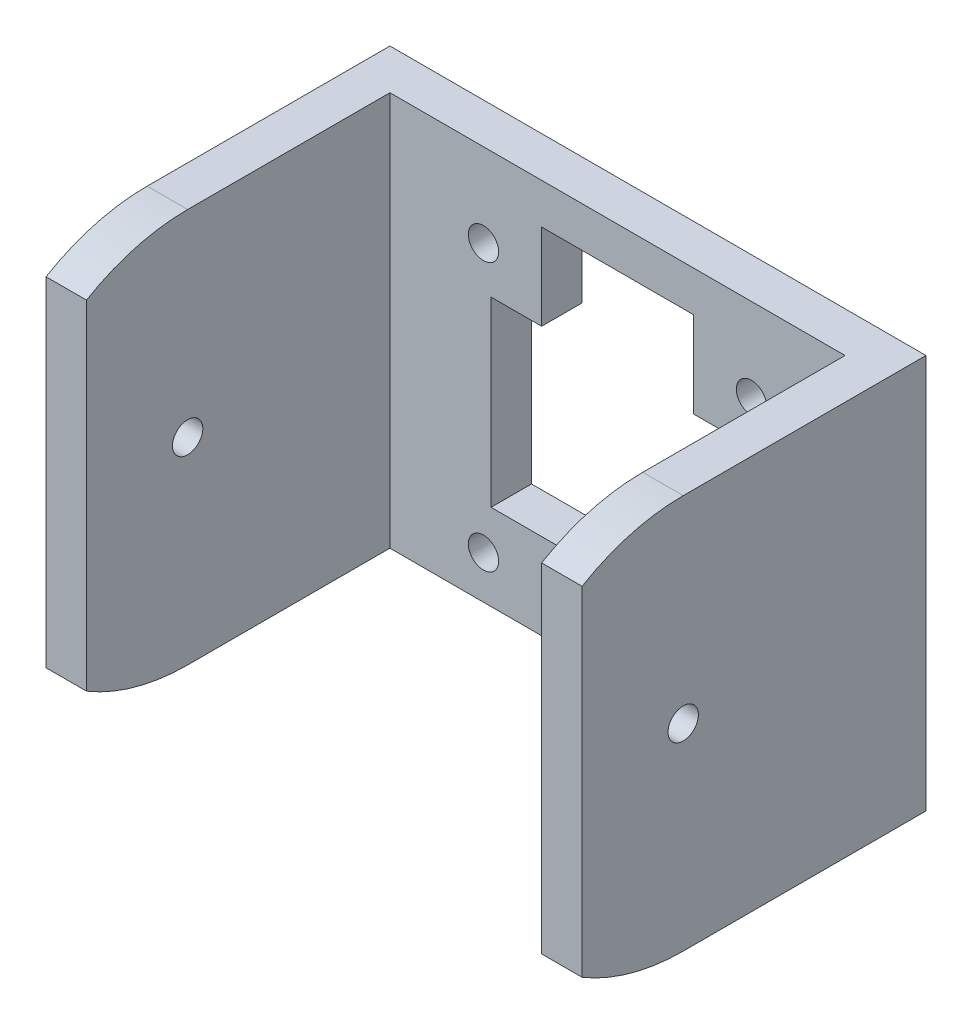
ISO-10303-21;
HEADER;
FILE_DESCRIPTION(('STEP AP214'),'2;1');
FILE_NAME('part.step','',(''),(''),'','','');
FILE_SCHEMA(('AUTOMOTIVE_DESIGN { 1 0 10303 214 1 1 1 1 }'));
ENDSEC;
DATA;
#1=APPLICATION_CONTEXT('core data for automotive mechanical design processes');
#2=APPLICATION_PROTOCOL_DEFINITION('international standard','automotive_design',2000,#1);
#3=PRODUCT_CONTEXT('',#1,'mechanical');
#4=PRODUCT('Part','Part','',(#3));
#5=PRODUCT_RELATED_PRODUCT_CATEGORY('part','',(#4));
#6=PRODUCT_DEFINITION_FORMATION('','',#4);
#7=PRODUCT_DEFINITION_CONTEXT('part definition',#1,'design');
#8=PRODUCT_DEFINITION('design','',#6,#7);
#9=PRODUCT_DEFINITION_SHAPE('','',#8);
#10=(LENGTH_UNIT() NAMED_UNIT(*) SI_UNIT(.MILLI.,.METRE.));
#11=(NAMED_UNIT(*) PLANE_ANGLE_UNIT() SI_UNIT($,.RADIAN.));
#12=(NAMED_UNIT(*) SI_UNIT($,.STERADIAN.) SOLID_ANGLE_UNIT());
#13=UNCERTAINTY_MEASURE_WITH_UNIT(LENGTH_MEASURE(1.E-05),#10,'distance_accuracy_value','');
#14=(GEOMETRIC_REPRESENTATION_CONTEXT(3) GLOBAL_UNCERTAINTY_ASSIGNED_CONTEXT((#13)) GLOBAL_UNIT_ASSIGNED_CONTEXT((#10,
#11,#12)) REPRESENTATION_CONTEXT('',''));
#15=CARTESIAN_POINT('',(0.,0.,0.));
#16=DIRECTION('',(0.,0.,1.));
#17=DIRECTION('',(1.,0.,0.));
#18=AXIS2_PLACEMENT_3D('',#15,#16,#17);
#19=CARTESIAN_POINT('',(-66.6859137443134,0.,0.));
#20=DIRECTION('',(1.,0.,0.));
#21=DIRECTION('',(0.,1.,0.));
#22=AXIS2_PLACEMENT_3D('',#19,#20,#21);
#23=PLANE('',#22);
#24=CARTESIAN_POINT('',(-66.6859137443134,28.1178512570567,24.));
#25=DIRECTION('',(1.,0.,0.));
#26=DIRECTION('',(0.,1.,0.));
#27=AXIS2_PLACEMENT_3D('',#24,#25,#26);
#28=CIRCLE('',#27,1.5);
#29=CARTESIAN_POINT('',(-66.6859137443134,29.6178512570567,24.));
#30=VERTEX_POINT('',#29);
#31=EDGE_CURVE('E455',#30,#30,#28,.F.);
#32=ORIENTED_EDGE('',*,*,#31,.T.);
#33=EDGE_LOOP('',(#32));
#34=FACE_BOUND('',#33,.T.);
#35=DIRECTION('',(0.,0.,1.));
#36=VECTOR('',#35,1.);
#37=CARTESIAN_POINT('',(-66.6859137443134,47.6178512570567,0.));
#38=LINE('',#37,#36);
#39=CARTESIAN_POINT('',(-66.6859137443134,47.6178512570567,0.));
#40=VERTEX_POINT('',#39);
#41=CARTESIAN_POINT('',(-66.6859137443134,47.6178512570567,24.));
#42=VERTEX_POINT('',#41);
#43=EDGE_CURVE('E215',#40,#42,#38,.T.);
#44=ORIENTED_EDGE('',*,*,#43,.T.);
#45=CARTESIAN_POINT('',(-66.6859137443134,28.1178512570567,24.));
#46=DIRECTION('',(1.,0.,0.));
#47=DIRECTION('',(0.,1.,0.));
#48=AXIS2_PLACEMENT_3D('',#45,#46,#47);
#49=CIRCLE('',#48,19.5);
#50=CARTESIAN_POINT('',(-66.6859137443134,44.8585202998399,34.));
#51=VERTEX_POINT('',#50);
#52=EDGE_CURVE('E180',#51,#42,#49,.F.);
#53=ORIENTED_EDGE('',*,*,#52,.F.);
#54=DIRECTION('',(0.,1.,0.));
#55=VECTOR('',#54,1.);
#56=CARTESIAN_POINT('',(-66.6859137443134,47.6178512570567,34.));
#57=LINE('',#56,#55);
#58=CARTESIAN_POINT('',(-66.6859137443134,11.3771822142735,34.));
#59=VERTEX_POINT('',#58);
#60=EDGE_CURVE('E415',#59,#51,#57,.T.);
#61=ORIENTED_EDGE('',*,*,#60,.F.);
#62=CARTESIAN_POINT('',(-66.6859137443134,28.1178512570567,24.));
#63=DIRECTION('',(1.,0.,0.));
#64=DIRECTION('',(0.,1.,0.));
#65=AXIS2_PLACEMENT_3D('',#62,#63,#64);
#66=CIRCLE('',#65,19.5);
#67=CARTESIAN_POINT('',(-66.6859137443134,8.6178512570567,24.));
#68=VERTEX_POINT('',#67);
#69=EDGE_CURVE('E468',#68,#59,#66,.F.);
#70=ORIENTED_EDGE('',*,*,#69,.F.);
#71=DIRECTION('',(0.,0.,-1.));
#72=VECTOR('',#71,1.);
#73=CARTESIAN_POINT('',(-66.6859137443134,8.61785125705671,4.));
#74=LINE('',#73,#72);
#75=CARTESIAN_POINT('',(-66.6859137443134,8.61785125705671,0.));
#76=VERTEX_POINT('',#75);
#77=EDGE_CURVE('E210',#68,#76,#74,.T.);
#78=ORIENTED_EDGE('',*,*,#77,.T.);
#79=DIRECTION('',(0.,1.,0.));
#80=VECTOR('',#79,1.);
#81=CARTESIAN_POINT('',(-66.6859137443134,8.61785125705671,0.));
#82=LINE('',#81,#80);
#83=EDGE_CURVE('E212',#76,#40,#82,.T.);
#84=ORIENTED_EDGE('',*,*,#83,.T.);
#85=EDGE_LOOP('',(#44,#53,#61,#70,#78,#84));
#86=FACE_BOUND('',#85,.T.);
#87=ADVANCED_FACE('F37',(#34,#86),#23,.T.);
#88=CARTESIAN_POINT('',(-119.685913744313,0.,0.));
#89=DIRECTION('',(-1.,0.,0.));
#90=DIRECTION('',(0.,0.,1.));
#91=AXIS2_PLACEMENT_3D('',#88,#89,#90);
#92=PLANE('',#91);
#93=CARTESIAN_POINT('',(-119.685913744313,28.1178512570567,24.));
#94=DIRECTION('',(-1.,0.,0.));
#95=DIRECTION('',(0.,0.,1.));
#96=AXIS2_PLACEMENT_3D('',#93,#94,#95);
#97=CIRCLE('',#96,1.5);
#98=CARTESIAN_POINT('',(-119.685913744313,28.1178512570567,25.5));
#99=VERTEX_POINT('',#98);
#100=EDGE_CURVE('E457',#99,#99,#97,.T.);
#101=ORIENTED_EDGE('',*,*,#100,.F.);
#102=EDGE_LOOP('',(#101));
#103=FACE_BOUND('',#102,.T.);
#104=DIRECTION('',(0.,-1.,0.));
#105=VECTOR('',#104,1.);
#106=CARTESIAN_POINT('',(-119.685913744313,47.6178512570567,34.));
#107=LINE('',#106,#105);
#108=CARTESIAN_POINT('',(-119.685913744313,44.8585202998399,34.));
#109=VERTEX_POINT('',#108);
#110=CARTESIAN_POINT('',(-119.685913744313,11.3771822142735,34.));
#111=VERTEX_POINT('',#110);
#112=EDGE_CURVE('E190',#109,#111,#107,.T.);
#113=ORIENTED_EDGE('',*,*,#112,.F.);
#114=CARTESIAN_POINT('',(-119.685913744313,28.1178512570567,24.));
#115=DIRECTION('',(-1.,0.,0.));
#116=DIRECTION('',(0.,0.,1.));
#117=AXIS2_PLACEMENT_3D('',#114,#115,#116);
#118=CIRCLE('',#117,19.5);
#119=CARTESIAN_POINT('',(-119.685913744313,47.6178512570567,24.));
#120=VERTEX_POINT('',#119);
#121=EDGE_CURVE('E61',#109,#120,#118,.T.);
#122=ORIENTED_EDGE('',*,*,#121,.T.);
#123=DIRECTION('',(0.,0.,-1.));
#124=VECTOR('',#123,1.);
#125=CARTESIAN_POINT('',(-119.685913744313,47.6178512570567,4.));
#126=LINE('',#125,#124);
#127=CARTESIAN_POINT('',(-119.685913744313,47.6178512570567,0.));
#128=VERTEX_POINT('',#127);
#129=EDGE_CURVE('E186',#120,#128,#126,.T.);
#130=ORIENTED_EDGE('',*,*,#129,.T.);
#131=DIRECTION('',(0.,-1.,0.));
#132=VECTOR('',#131,1.);
#133=CARTESIAN_POINT('',(-119.685913744313,47.6178512570567,0.));
#134=LINE('',#133,#132);
#135=CARTESIAN_POINT('',(-119.685913744313,8.6178512570567,0.));
#136=VERTEX_POINT('',#135);
#137=EDGE_CURVE('E199',#128,#136,#134,.T.);
#138=ORIENTED_EDGE('',*,*,#137,.T.);
#139=DIRECTION('',(0.,0.,1.));
#140=VECTOR('',#139,1.);
#141=CARTESIAN_POINT('',(-119.685913744313,8.6178512570567,0.));
#142=LINE('',#141,#140);
#143=CARTESIAN_POINT('',(-119.685913744313,8.6178512570567,24.));
#144=VERTEX_POINT('',#143);
#145=EDGE_CURVE('E202',#136,#144,#142,.T.);
#146=ORIENTED_EDGE('',*,*,#145,.T.);
#147=CARTESIAN_POINT('',(-119.685913744313,28.1178512570567,24.));
#148=DIRECTION('',(-1.,0.,0.));
#149=DIRECTION('',(0.,0.,1.));
#150=AXIS2_PLACEMENT_3D('',#147,#148,#149);
#151=CIRCLE('',#150,19.5);
#152=EDGE_CURVE('E464',#144,#111,#151,.T.);
#153=ORIENTED_EDGE('',*,*,#152,.T.);
#154=EDGE_LOOP('',(#113,#122,#130,#138,#146,#153));
#155=FACE_BOUND('',#154,.T.);
#156=ADVANCED_FACE('F184',(#103,#155),#92,.T.);
#157=CARTESIAN_POINT('',(-115.685913744313,47.6178512570567,34.));
#158=DIRECTION('',(-1.,0.,0.));
#159=DIRECTION('',(0.,0.,1.));
#160=AXIS2_PLACEMENT_3D('',#157,#158,#159);
#161=PLANE('',#160);
#162=CARTESIAN_POINT('',(-115.685913744313,28.1178512570567,24.));
#163=DIRECTION('',(-1.,0.,0.));
#164=DIRECTION('',(0.,0.,1.));
#165=AXIS2_PLACEMENT_3D('',#162,#163,#164);
#166=CIRCLE('',#165,1.5);
#167=CARTESIAN_POINT('',(-115.685913744313,28.1178512570567,25.5));
#168=VERTEX_POINT('',#167);
#169=EDGE_CURVE('E450',#168,#168,#166,.T.);
#170=ORIENTED_EDGE('',*,*,#169,.T.);
#171=EDGE_LOOP('',(#170));
#172=FACE_BOUND('',#171,.T.);
#173=CARTESIAN_POINT('',(-115.685913744313,28.1178512570567,24.));
#174=DIRECTION('',(-1.,0.,0.));
#175=DIRECTION('',(0.,0.,1.));
#176=AXIS2_PLACEMENT_3D('',#173,#174,#175);
#177=CIRCLE('',#176,19.5);
#178=CARTESIAN_POINT('',(-115.685913744313,44.8585202998399,34.));
#179=VERTEX_POINT('',#178);
#180=CARTESIAN_POINT('',(-115.685913744313,47.6178512570567,24.));
#181=VERTEX_POINT('',#180);
#182=EDGE_CURVE('E175',#179,#181,#177,.T.);
#183=ORIENTED_EDGE('',*,*,#182,.F.);
#184=DIRECTION('',(0.,1.,0.));
#185=VECTOR('',#184,1.);
#186=CARTESIAN_POINT('',(-115.685913744313,47.6178512570567,34.));
#187=LINE('',#186,#185);
#188=CARTESIAN_POINT('',(-115.685913744313,11.3771822142735,34.));
#189=VERTEX_POINT('',#188);
#190=EDGE_CURVE('E429',#189,#179,#187,.T.);
#191=ORIENTED_EDGE('',*,*,#190,.F.);
#192=CARTESIAN_POINT('',(-115.685913744313,28.1178512570567,24.));
#193=DIRECTION('',(-1.,0.,0.));
#194=DIRECTION('',(0.,0.,1.));
#195=AXIS2_PLACEMENT_3D('',#192,#193,#194);
#196=CIRCLE('',#195,19.5);
#197=CARTESIAN_POINT('',(-115.685913744313,8.6178512570567,24.));
#198=VERTEX_POINT('',#197);
#199=EDGE_CURVE('E53',#198,#189,#196,.T.);
#200=ORIENTED_EDGE('',*,*,#199,.F.);
#201=DIRECTION('',(0.,0.,-1.));
#202=VECTOR('',#201,1.);
#203=CARTESIAN_POINT('',(-115.685913744313,8.6178512570567,34.));
#204=LINE('',#203,#202);
#205=CARTESIAN_POINT('',(-115.685913744313,8.6178512570567,4.));
#206=VERTEX_POINT('',#205);
#207=EDGE_CURVE('E200',#198,#206,#204,.T.);
#208=ORIENTED_EDGE('',*,*,#207,.T.);
#209=DIRECTION('',(0.,1.,0.));
#210=VECTOR('',#209,1.);
#211=CARTESIAN_POINT('',(-115.685913744313,47.6178512570567,4.));
#212=LINE('',#211,#210);
#213=CARTESIAN_POINT('',(-115.685913744313,47.6178512570567,4.));
#214=VERTEX_POINT('',#213);
#215=EDGE_CURVE('E423',#206,#214,#212,.T.);
#216=ORIENTED_EDGE('',*,*,#215,.T.);
#217=DIRECTION('',(0.,0.,-1.));
#218=VECTOR('',#217,1.);
#219=CARTESIAN_POINT('',(-115.685913744313,47.6178512570567,34.));
#220=LINE('',#219,#218);
#221=EDGE_CURVE('E204',#181,#214,#220,.T.);
#222=ORIENTED_EDGE('',*,*,#221,.F.);
#223=EDGE_LOOP('',(#183,#191,#200,#208,#216,#222));
#224=FACE_BOUND('',#223,.T.);
#225=ADVANCED_FACE('F363',(#172,#224),#161,.F.);
#226=CARTESIAN_POINT('',(0.,0.,34.));
#227=DIRECTION('',(0.,0.,1.));
#228=DIRECTION('',(1.,0.,0.));
#229=AXIS2_PLACEMENT_3D('',#226,#227,#228);
#230=PLANE('',#229);
#231=ORIENTED_EDGE('',*,*,#190,.T.);
#232=DIRECTION('',(-1.,0.,0.));
#233=VECTOR('',#232,1.);
#234=CARTESIAN_POINT('',(-56.3122014227067,44.8585202998399,34.));
#235=LINE('',#234,#233);
#236=EDGE_CURVE('E416',#179,#109,#235,.T.);
#237=ORIENTED_EDGE('',*,*,#236,.T.);
#238=ORIENTED_EDGE('',*,*,#112,.T.);
#239=DIRECTION('',(-1.,0.,0.));
#240=VECTOR('',#239,1.);
#241=CARTESIAN_POINT('',(-56.3122014227067,11.3771822142735,34.));
#242=LINE('',#241,#240);
#243=EDGE_CURVE('E467',#189,#111,#242,.T.);
#244=ORIENTED_EDGE('',*,*,#243,.F.);
#245=EDGE_LOOP('',(#231,#237,#238,#244));
#246=FACE_BOUND('',#245,.T.);
#247=ADVANCED_FACE('F371',(#246),#230,.T.);
#248=CARTESIAN_POINT('',(-70.6859137443134,47.6178512570567,34.));
#249=DIRECTION('',(1.,0.,0.));
#250=DIRECTION('',(0.,0.,-1.));
#251=AXIS2_PLACEMENT_3D('',#248,#249,#250);
#252=PLANE('',#251);
#253=CARTESIAN_POINT('',(-70.6859137443134,28.1178512570567,24.));
#254=DIRECTION('',(1.,0.,0.));
#255=DIRECTION('',(0.,0.,-1.));
#256=AXIS2_PLACEMENT_3D('',#253,#254,#255);
#257=CIRCLE('',#256,1.5);
#258=CARTESIAN_POINT('',(-70.6859137443134,28.1178512570567,22.5));
#259=VERTEX_POINT('',#258);
#260=EDGE_CURVE('E41',#259,#259,#257,.T.);
#261=ORIENTED_EDGE('',*,*,#260,.T.);
#262=EDGE_LOOP('',(#261));
#263=FACE_BOUND('',#262,.T.);
#264=CARTESIAN_POINT('',(-70.6859137443134,28.1178512570567,24.));
#265=DIRECTION('',(1.,0.,0.));
#266=DIRECTION('',(0.,0.,-1.));
#267=AXIS2_PLACEMENT_3D('',#264,#265,#266);
#268=CIRCLE('',#267,19.5);
#269=CARTESIAN_POINT('',(-70.6859137443134,47.6178512570567,24.));
#270=VERTEX_POINT('',#269);
#271=CARTESIAN_POINT('',(-70.6859137443134,44.8585202998399,34.));
#272=VERTEX_POINT('',#271);
#273=EDGE_CURVE('E403',#270,#272,#268,.T.);
#274=ORIENTED_EDGE('',*,*,#273,.F.);
#275=DIRECTION('',(0.,0.,-1.));
#276=VECTOR('',#275,1.);
#277=CARTESIAN_POINT('',(-70.6859137443134,47.6178512570567,34.));
#278=LINE('',#277,#276);
#279=CARTESIAN_POINT('',(-70.6859137443134,47.6178512570567,4.));
#280=VERTEX_POINT('',#279);
#281=EDGE_CURVE('E448',#270,#280,#278,.T.);
#282=ORIENTED_EDGE('',*,*,#281,.T.);
#283=DIRECTION('',(0.,-1.,0.));
#284=VECTOR('',#283,1.);
#285=CARTESIAN_POINT('',(-70.6859137443134,47.6178512570567,4.));
#286=LINE('',#285,#284);
#287=CARTESIAN_POINT('',(-70.6859137443134,8.61785125705671,4.));
#288=VERTEX_POINT('',#287);
#289=EDGE_CURVE('E420',#280,#288,#286,.T.);
#290=ORIENTED_EDGE('',*,*,#289,.T.);
#291=DIRECTION('',(0.,0.,-1.));
#292=VECTOR('',#291,1.);
#293=CARTESIAN_POINT('',(-70.6859137443134,8.61785125705671,34.));
#294=LINE('',#293,#292);
#295=CARTESIAN_POINT('',(-70.6859137443134,8.6178512570567,24.));
#296=VERTEX_POINT('',#295);
#297=EDGE_CURVE('E425',#296,#288,#294,.T.);
#298=ORIENTED_EDGE('',*,*,#297,.F.);
#299=CARTESIAN_POINT('',(-70.6859137443134,28.1178512570567,24.));
#300=DIRECTION('',(1.,0.,0.));
#301=DIRECTION('',(0.,0.,-1.));
#302=AXIS2_PLACEMENT_3D('',#299,#300,#301);
#303=CIRCLE('',#302,19.5);
#304=CARTESIAN_POINT('',(-70.6859137443134,11.3771822142735,34.));
#305=VERTEX_POINT('',#304);
#306=EDGE_CURVE('E191',#305,#296,#303,.T.);
#307=ORIENTED_EDGE('',*,*,#306,.F.);
#308=DIRECTION('',(0.,-1.,0.));
#309=VECTOR('',#308,1.);
#310=CARTESIAN_POINT('',(-70.6859137443134,47.6178512570567,34.));
#311=LINE('',#310,#309);
#312=EDGE_CURVE('E413',#272,#305,#311,.T.);
#313=ORIENTED_EDGE('',*,*,#312,.F.);
#314=EDGE_LOOP('',(#274,#282,#290,#298,#307,#313));
#315=FACE_BOUND('',#314,.T.);
#316=ADVANCED_FACE('F375',(#263,#315),#252,.F.);
#317=CARTESIAN_POINT('',(0.,0.,34.));
#318=DIRECTION('',(0.,0.,1.));
#319=DIRECTION('',(1.,0.,0.));
#320=AXIS2_PLACEMENT_3D('',#317,#318,#319);
#321=PLANE('',#320);
#322=ORIENTED_EDGE('',*,*,#60,.T.);
#323=EDGE_CURVE('E192',#51,#272,#235,.T.);
#324=ORIENTED_EDGE('',*,*,#323,.T.);
#325=ORIENTED_EDGE('',*,*,#312,.T.);
#326=EDGE_CURVE('E465',#59,#305,#242,.T.);
#327=ORIENTED_EDGE('',*,*,#326,.F.);
#328=EDGE_LOOP('',(#322,#324,#325,#327));
#329=FACE_BOUND('',#328,.T.);
#330=ADVANCED_FACE('F377',(#329),#321,.T.);
#331=CARTESIAN_POINT('',(0.,0.,4.));
#332=DIRECTION('',(0.,0.,1.));
#333=DIRECTION('',(1.,0.,0.));
#334=AXIS2_PLACEMENT_3D('',#331,#332,#333);
#335=PLANE('',#334);
#336=DIRECTION('',(0.,-1.,0.));
#337=VECTOR('',#336,1.);
#338=CARTESIAN_POINT('',(-100.685913744313,43.6178512570567,4.));
#339=LINE('',#338,#337);
#340=CARTESIAN_POINT('',(-100.685913744313,43.6178512570567,4.));
#341=VERTEX_POINT('',#340);
#342=CARTESIAN_POINT('',(-100.685913744313,35.1178512570567,4.));
#343=VERTEX_POINT('',#342);
#344=EDGE_CURVE('E224',#341,#343,#339,.T.);
#345=ORIENTED_EDGE('',*,*,#344,.F.);
#346=DIRECTION('',(1.,0.,0.));
#347=VECTOR('',#346,1.);
#348=CARTESIAN_POINT('',(-110.685913744313,43.6178512570567,4.));
#349=LINE('',#348,#347);
#350=CARTESIAN_POINT('',(-85.6859137443134,43.6178512570567,4.));
#351=VERTEX_POINT('',#350);
#352=EDGE_CURVE('E218',#341,#351,#349,.T.);
#353=ORIENTED_EDGE('',*,*,#352,.T.);
#354=DIRECTION('',(0.,1.,0.));
#355=VECTOR('',#354,1.);
#356=CARTESIAN_POINT('',(-85.6859137443134,43.6178512570567,4.));
#357=LINE('',#356,#355);
#358=CARTESIAN_POINT('',(-85.6859137443134,35.1178512570567,4.));
#359=VERTEX_POINT('',#358);
#360=EDGE_CURVE('E237',#359,#351,#357,.T.);
#361=ORIENTED_EDGE('',*,*,#360,.F.);
#362=DIRECTION('',(-1.,0.,0.));
#363=VECTOR('',#362,1.);
#364=CARTESIAN_POINT('',(-105.685913744313,35.1178512570567,4.));
#365=LINE('',#364,#363);
#366=CARTESIAN_POINT('',(-80.6859137443134,35.1178512570567,4.));
#367=VERTEX_POINT('',#366);
#368=EDGE_CURVE('E248',#367,#359,#365,.T.);
#369=ORIENTED_EDGE('',*,*,#368,.F.);
#370=DIRECTION('',(0.,1.,0.));
#371=VECTOR('',#370,1.);
#372=CARTESIAN_POINT('',(-80.6859137443134,17.1178512570567,4.));
#373=LINE('',#372,#371);
#374=CARTESIAN_POINT('',(-80.6859137443134,17.1178512570567,4.));
#375=VERTEX_POINT('',#374);
#376=EDGE_CURVE('E244',#375,#367,#373,.T.);
#377=ORIENTED_EDGE('',*,*,#376,.F.);
#378=DIRECTION('',(1.,0.,0.));
#379=VECTOR('',#378,1.);
#380=CARTESIAN_POINT('',(-105.685913744313,17.1178512570567,4.));
#381=LINE('',#380,#379);
#382=CARTESIAN_POINT('',(-105.685913744313,17.1178512570567,4.));
#383=VERTEX_POINT('',#382);
#384=EDGE_CURVE('E254',#383,#375,#381,.T.);
#385=ORIENTED_EDGE('',*,*,#384,.F.);
#386=DIRECTION('',(0.,-1.,0.));
#387=VECTOR('',#386,1.);
#388=CARTESIAN_POINT('',(-105.685913744313,17.1178512570567,4.));
#389=LINE('',#388,#387);
#390=CARTESIAN_POINT('',(-105.685913744313,35.1178512570567,4.));
#391=VERTEX_POINT('',#390);
#392=EDGE_CURVE('E251',#391,#383,#389,.T.);
#393=ORIENTED_EDGE('',*,*,#392,.F.);
#394=EDGE_CURVE('E246',#343,#391,#365,.T.);
#395=ORIENTED_EDGE('',*,*,#394,.F.);
#396=EDGE_LOOP('',(#345,#353,#361,#369,#377,#385,#393,#395));
#397=FACE_BOUND('',#396,.T.);
#398=CARTESIAN_POINT('',(-79.9359137443134,39.3678512570567,4.));
#399=DIRECTION('',(0.,0.,1.));
#400=DIRECTION('',(1.,0.,0.));
#401=AXIS2_PLACEMENT_3D('',#398,#399,#400);
#402=CIRCLE('',#401,1.50000000000001);
#403=CARTESIAN_POINT('',(-78.4359137443133,39.3678512570567,4.));
#404=VERTEX_POINT('',#403);
#405=EDGE_CURVE('E285',#404,#404,#402,.T.);
#406=ORIENTED_EDGE('',*,*,#405,.F.);
#407=EDGE_LOOP('',(#406));
#408=FACE_BOUND('',#407,.T.);
#409=CARTESIAN_POINT('',(-106.435913744313,39.3678512570567,4.));
#410=DIRECTION('',(0.,0.,1.));
#411=DIRECTION('',(1.,0.,0.));
#412=AXIS2_PLACEMENT_3D('',#409,#410,#411);
#413=CIRCLE('',#412,1.5);
#414=CARTESIAN_POINT('',(-104.935913744313,39.3678512570567,4.));
#415=VERTEX_POINT('',#414);
#416=EDGE_CURVE('E297',#415,#415,#413,.T.);
#417=ORIENTED_EDGE('',*,*,#416,.F.);
#418=EDGE_LOOP('',(#417));
#419=FACE_BOUND('',#418,.T.);
#420=CARTESIAN_POINT('',(-79.9359137443134,12.8678512570567,4.));
#421=DIRECTION('',(0.,0.,1.));
#422=DIRECTION('',(-1.,0.,0.));
#423=AXIS2_PLACEMENT_3D('',#420,#421,#422);
#424=CIRCLE('',#423,1.50000000000001);
#425=CARTESIAN_POINT('',(-81.4359137443134,12.8678512570567,4.));
#426=VERTEX_POINT('',#425);
#427=EDGE_CURVE('E291',#426,#426,#424,.T.);
#428=ORIENTED_EDGE('',*,*,#427,.F.);
#429=EDGE_LOOP('',(#428));
#430=FACE_BOUND('',#429,.T.);
#431=CARTESIAN_POINT('',(-106.435913744313,12.8678512570567,4.));
#432=DIRECTION('',(0.,0.,1.));
#433=DIRECTION('',(-1.,0.,0.));
#434=AXIS2_PLACEMENT_3D('',#431,#432,#433);
#435=CIRCLE('',#434,1.5);
#436=CARTESIAN_POINT('',(-107.935913744313,12.8678512570567,4.));
#437=VERTEX_POINT('',#436);
#438=EDGE_CURVE('E279',#437,#437,#435,.T.);
#439=ORIENTED_EDGE('',*,*,#438,.F.);
#440=EDGE_LOOP('',(#439));
#441=FACE_BOUND('',#440,.T.);
#442=DIRECTION('',(1.,0.,0.));
#443=VECTOR('',#442,1.);
#444=CARTESIAN_POINT('',(-110.685913744313,8.6178512570567,4.));
#445=LINE('',#444,#443);
#446=EDGE_CURVE('E303',#206,#288,#445,.T.);
#447=ORIENTED_EDGE('',*,*,#446,.T.);
#448=ORIENTED_EDGE('',*,*,#289,.F.);
#449=DIRECTION('',(1.,0.,0.));
#450=VECTOR('',#449,1.);
#451=CARTESIAN_POINT('',(-110.685913744313,47.6178512570567,4.));
#452=LINE('',#451,#450);
#453=EDGE_CURVE('E219',#214,#280,#452,.T.);
#454=ORIENTED_EDGE('',*,*,#453,.F.);
#455=ORIENTED_EDGE('',*,*,#215,.F.);
#456=EDGE_LOOP('',(#447,#448,#454,#455));
#457=FACE_BOUND('',#456,.T.);
#458=ADVANCED_FACE('F317',(#397,#408,#419,#430,#441,#457),#335,.T.);
#459=CARTESIAN_POINT('',(-105.685913744313,35.1178512570567,4.));
#460=DIRECTION('',(0.,-1.,0.));
#461=DIRECTION('',(0.,0.,-1.));
#462=AXIS2_PLACEMENT_3D('',#459,#460,#461);
#463=PLANE('',#462);
#464=DIRECTION('',(0.,0.,-1.));
#465=VECTOR('',#464,1.);
#466=CARTESIAN_POINT('',(-100.685913744313,35.1178512570567,4.));
#467=LINE('',#466,#465);
#468=CARTESIAN_POINT('',(-100.685913744313,35.1178512570567,0.));
#469=VERTEX_POINT('',#468);
#470=EDGE_CURVE('E11',#343,#469,#467,.T.);
#471=ORIENTED_EDGE('',*,*,#470,.F.);
#472=ORIENTED_EDGE('',*,*,#394,.T.);
#473=DIRECTION('',(0.,0.,-1.));
#474=VECTOR('',#473,1.);
#475=CARTESIAN_POINT('',(-105.685913744313,35.1178512570567,4.));
#476=LINE('',#475,#474);
#477=CARTESIAN_POINT('',(-105.685913744313,35.1178512570567,0.));
#478=VERTEX_POINT('',#477);
#479=EDGE_CURVE('E272',#391,#478,#476,.T.);
#480=ORIENTED_EDGE('',*,*,#479,.T.);
#481=DIRECTION('',(-1.,0.,0.));
#482=VECTOR('',#481,1.);
#483=CARTESIAN_POINT('',(-105.685913744313,35.1178512570567,0.));
#484=LINE('',#483,#482);
#485=EDGE_CURVE('E259',#469,#478,#484,.T.);
#486=ORIENTED_EDGE('',*,*,#485,.F.);
#487=EDGE_LOOP('',(#471,#472,#480,#486));
#488=FACE_BOUND('',#487,.T.);
#489=ADVANCED_FACE('F340',(#488),#463,.T.);
#490=CARTESIAN_POINT('',(0.,0.,0.));
#491=DIRECTION('',(0.,0.,1.));
#492=DIRECTION('',(1.,0.,0.));
#493=AXIS2_PLACEMENT_3D('',#490,#491,#492);
#494=PLANE('',#493);
#495=DIRECTION('',(1.,0.,0.));
#496=VECTOR('',#495,1.);
#497=CARTESIAN_POINT('',(-110.685913744313,8.6178512570567,0.));
#498=LINE('',#497,#496);
#499=EDGE_CURVE('E300',#136,#76,#498,.T.);
#500=ORIENTED_EDGE('',*,*,#499,.F.);
#501=ORIENTED_EDGE('',*,*,#137,.F.);
#502=DIRECTION('',(-1.,0.,0.));
#503=VECTOR('',#502,1.);
#504=CARTESIAN_POINT('',(-110.685913744313,47.6178512570567,0.));
#505=LINE('',#504,#503);
#506=EDGE_CURVE('E197',#40,#128,#505,.T.);
#507=ORIENTED_EDGE('',*,*,#506,.F.);
#508=ORIENTED_EDGE('',*,*,#83,.F.);
#509=EDGE_LOOP('',(#500,#501,#507,#508));
#510=FACE_BOUND('',#509,.T.);
#511=CARTESIAN_POINT('',(-106.435913744313,12.8678512570567,0.));
#512=DIRECTION('',(0.,0.,1.));
#513=DIRECTION('',(-1.,0.,0.));
#514=AXIS2_PLACEMENT_3D('',#511,#512,#513);
#515=CIRCLE('',#514,1.5);
#516=CARTESIAN_POINT('',(-107.935913744313,12.8678512570567,0.));
#517=VERTEX_POINT('',#516);
#518=EDGE_CURVE('E278',#517,#517,#515,.T.);
#519=ORIENTED_EDGE('',*,*,#518,.T.);
#520=EDGE_LOOP('',(#519));
#521=FACE_BOUND('',#520,.T.);
#522=CARTESIAN_POINT('',(-79.9359137443134,39.3678512570567,0.));
#523=DIRECTION('',(0.,0.,1.));
#524=DIRECTION('',(1.,0.,0.));
#525=AXIS2_PLACEMENT_3D('',#522,#523,#524);
#526=CIRCLE('',#525,1.50000000000001);
#527=CARTESIAN_POINT('',(-78.4359137443133,39.3678512570567,0.));
#528=VERTEX_POINT('',#527);
#529=EDGE_CURVE('E282',#528,#528,#526,.T.);
#530=ORIENTED_EDGE('',*,*,#529,.T.);
#531=EDGE_LOOP('',(#530));
#532=FACE_BOUND('',#531,.T.);
#533=CARTESIAN_POINT('',(-79.9359137443134,12.8678512570567,0.));
#534=DIRECTION('',(0.,0.,1.));
#535=DIRECTION('',(-1.,0.,0.));
#536=AXIS2_PLACEMENT_3D('',#533,#534,#535);
#537=CIRCLE('',#536,1.50000000000001);
#538=CARTESIAN_POINT('',(-81.4359137443134,12.8678512570567,0.));
#539=VERTEX_POINT('',#538);
#540=EDGE_CURVE('E288',#539,#539,#537,.T.);
#541=ORIENTED_EDGE('',*,*,#540,.T.);
#542=EDGE_LOOP('',(#541));
#543=FACE_BOUND('',#542,.T.);
#544=CARTESIAN_POINT('',(-106.435913744313,39.3678512570567,0.));
#545=DIRECTION('',(0.,0.,1.));
#546=DIRECTION('',(1.,0.,0.));
#547=AXIS2_PLACEMENT_3D('',#544,#545,#546);
#548=CIRCLE('',#547,1.5);
#549=CARTESIAN_POINT('',(-104.935913744313,39.3678512570567,0.));
#550=VERTEX_POINT('',#549);
#551=EDGE_CURVE('E294',#550,#550,#548,.T.);
#552=ORIENTED_EDGE('',*,*,#551,.T.);
#553=EDGE_LOOP('',(#552));
#554=FACE_BOUND('',#553,.T.);
#555=DIRECTION('',(-1.,0.,0.));
#556=VECTOR('',#555,1.);
#557=CARTESIAN_POINT('',(-110.685913744313,43.6178512570567,0.));
#558=LINE('',#557,#556);
#559=CARTESIAN_POINT('',(-85.6859137443134,43.6178512570567,0.));
#560=VERTEX_POINT('',#559);
#561=CARTESIAN_POINT('',(-100.685913744313,43.6178512570567,0.));
#562=VERTEX_POINT('',#561);
#563=EDGE_CURVE('E222',#560,#562,#558,.T.);
#564=ORIENTED_EDGE('',*,*,#563,.T.);
#565=DIRECTION('',(0.,1.,0.));
#566=VECTOR('',#565,1.);
#567=CARTESIAN_POINT('',(-100.685913744313,43.6178512570567,0.));
#568=LINE('',#567,#566);
#569=EDGE_CURVE('E231',#469,#562,#568,.T.);
#570=ORIENTED_EDGE('',*,*,#569,.F.);
#571=ORIENTED_EDGE('',*,*,#485,.T.);
#572=DIRECTION('',(0.,-1.,0.));
#573=VECTOR('',#572,1.);
#574=CARTESIAN_POINT('',(-105.685913744313,17.1178512570567,0.));
#575=LINE('',#574,#573);
#576=CARTESIAN_POINT('',(-105.685913744313,17.1178512570567,0.));
#577=VERTEX_POINT('',#576);
#578=EDGE_CURVE('E263',#478,#577,#575,.T.);
#579=ORIENTED_EDGE('',*,*,#578,.T.);
#580=DIRECTION('',(1.,0.,0.));
#581=VECTOR('',#580,1.);
#582=CARTESIAN_POINT('',(-105.685913744313,17.1178512570567,0.));
#583=LINE('',#582,#581);
#584=CARTESIAN_POINT('',(-80.6859137443134,17.1178512570567,0.));
#585=VERTEX_POINT('',#584);
#586=EDGE_CURVE('E247',#577,#585,#583,.T.);
#587=ORIENTED_EDGE('',*,*,#586,.T.);
#588=DIRECTION('',(0.,1.,0.));
#589=VECTOR('',#588,1.);
#590=CARTESIAN_POINT('',(-80.6859137443134,17.1178512570567,0.));
#591=LINE('',#590,#589);
#592=CARTESIAN_POINT('',(-80.6859137443134,35.1178512570567,0.));
#593=VERTEX_POINT('',#592);
#594=EDGE_CURVE('E235',#585,#593,#591,.T.);
#595=ORIENTED_EDGE('',*,*,#594,.T.);
#596=CARTESIAN_POINT('',(-85.6859137443134,35.1178512570567,0.));
#597=VERTEX_POINT('',#596);
#598=EDGE_CURVE('E260',#593,#597,#484,.T.);
#599=ORIENTED_EDGE('',*,*,#598,.T.);
#600=DIRECTION('',(0.,-1.,0.));
#601=VECTOR('',#600,1.);
#602=CARTESIAN_POINT('',(-85.6859137443134,43.6178512570567,0.));
#603=LINE('',#602,#601);
#604=EDGE_CURVE('E229',#560,#597,#603,.T.);
#605=ORIENTED_EDGE('',*,*,#604,.F.);
#606=EDGE_LOOP('',(#564,#570,#571,#579,#587,#595,#599,#605));
#607=FACE_BOUND('',#606,.T.);
#608=ADVANCED_FACE('F326',(#510,#521,#532,#543,#554,#607),#494,.F.);
#609=CARTESIAN_POINT('',(-110.685913744313,8.6178512570567,4.));
#610=DIRECTION('',(0.,1.,0.));
#611=DIRECTION('',(0.,0.,1.));
#612=AXIS2_PLACEMENT_3D('',#609,#610,#611);
#613=PLANE('',#612);
#614=ORIENTED_EDGE('',*,*,#77,.F.);
#615=DIRECTION('',(-1.,0.,0.));
#616=VECTOR('',#615,1.);
#617=CARTESIAN_POINT('',(-56.3122014227067,8.6178512570567,24.));
#618=LINE('',#617,#616);
#619=EDGE_CURVE('E447',#68,#296,#618,.T.);
#620=ORIENTED_EDGE('',*,*,#619,.T.);
#621=ORIENTED_EDGE('',*,*,#297,.T.);
#622=ORIENTED_EDGE('',*,*,#446,.F.);
#623=ORIENTED_EDGE('',*,*,#207,.F.);
#624=EDGE_CURVE('E445',#198,#144,#618,.T.);
#625=ORIENTED_EDGE('',*,*,#624,.T.);
#626=ORIENTED_EDGE('',*,*,#145,.F.);
#627=ORIENTED_EDGE('',*,*,#499,.T.);
#628=EDGE_LOOP('',(#614,#620,#621,#622,#623,#625,#626,#627));
#629=FACE_BOUND('',#628,.T.);
#630=ADVANCED_FACE('F39',(#629),#613,.F.);
#631=CARTESIAN_POINT('',(-106.435913744313,39.3678512570567,4.));
#632=DIRECTION('',(0.,0.,-1.));
#633=DIRECTION('',(-1.,0.,0.));
#634=AXIS2_PLACEMENT_3D('',#631,#632,#633);
#635=CYLINDRICAL_SURFACE('',#634,1.5);
#636=ORIENTED_EDGE('',*,*,#416,.T.);
#637=EDGE_LOOP('',(#636));
#638=FACE_BOUND('',#637,.T.);
#639=ORIENTED_EDGE('',*,*,#551,.F.);
#640=EDGE_LOOP('',(#639));
#641=FACE_BOUND('',#640,.T.);
#642=ADVANCED_FACE('F484',(#638,#641),#635,.F.);
#643=CARTESIAN_POINT('',(-79.9359137443134,12.8678512570567,4.));
#644=DIRECTION('',(0.,0.,-1.));
#645=DIRECTION('',(-1.,0.,0.));
#646=AXIS2_PLACEMENT_3D('',#643,#644,#645);
#647=CYLINDRICAL_SURFACE('',#646,1.50000000000001);
#648=ORIENTED_EDGE('',*,*,#427,.T.);
#649=EDGE_LOOP('',(#648));
#650=FACE_BOUND('',#649,.T.);
#651=ORIENTED_EDGE('',*,*,#540,.F.);
#652=EDGE_LOOP('',(#651));
#653=FACE_BOUND('',#652,.T.);
#654=ADVANCED_FACE('F486',(#650,#653),#647,.F.);
#655=CARTESIAN_POINT('',(-79.9359137443134,39.3678512570567,4.));
#656=DIRECTION('',(0.,0.,-1.));
#657=DIRECTION('',(-1.,0.,0.));
#658=AXIS2_PLACEMENT_3D('',#655,#656,#657);
#659=CYLINDRICAL_SURFACE('',#658,1.50000000000001);
#660=ORIENTED_EDGE('',*,*,#405,.T.);
#661=EDGE_LOOP('',(#660));
#662=FACE_BOUND('',#661,.T.);
#663=ORIENTED_EDGE('',*,*,#529,.F.);
#664=EDGE_LOOP('',(#663));
#665=FACE_BOUND('',#664,.T.);
#666=ADVANCED_FACE('F493',(#662,#665),#659,.F.);
#667=CARTESIAN_POINT('',(-106.435913744313,12.8678512570567,4.));
#668=DIRECTION('',(0.,0.,-1.));
#669=DIRECTION('',(-1.,0.,0.));
#670=AXIS2_PLACEMENT_3D('',#667,#668,#669);
#671=CYLINDRICAL_SURFACE('',#670,1.5);
#672=ORIENTED_EDGE('',*,*,#438,.T.);
#673=EDGE_LOOP('',(#672));
#674=FACE_BOUND('',#673,.T.);
#675=ORIENTED_EDGE('',*,*,#518,.F.);
#676=EDGE_LOOP('',(#675));
#677=FACE_BOUND('',#676,.T.);
#678=ADVANCED_FACE('F512',(#674,#677),#671,.F.);
#679=CARTESIAN_POINT('',(-80.6859137443134,17.1178512570567,4.));
#680=DIRECTION('',(-1.,0.,0.));
#681=DIRECTION('',(0.,0.,1.));
#682=AXIS2_PLACEMENT_3D('',#679,#680,#681);
#683=PLANE('',#682);
#684=ORIENTED_EDGE('',*,*,#594,.F.);
#685=DIRECTION('',(0.,0.,-1.));
#686=VECTOR('',#685,1.);
#687=CARTESIAN_POINT('',(-80.6859137443134,17.1178512570567,4.));
#688=LINE('',#687,#686);
#689=EDGE_CURVE('E256',#375,#585,#688,.T.);
#690=ORIENTED_EDGE('',*,*,#689,.F.);
#691=ORIENTED_EDGE('',*,*,#376,.T.);
#692=DIRECTION('',(0.,0.,-1.));
#693=VECTOR('',#692,1.);
#694=CARTESIAN_POINT('',(-80.6859137443134,35.1178512570567,4.));
#695=LINE('',#694,#693);
#696=EDGE_CURVE('E275',#367,#593,#695,.T.);
#697=ORIENTED_EDGE('',*,*,#696,.T.);
#698=EDGE_LOOP('',(#684,#690,#691,#697));
#699=FACE_BOUND('',#698,.T.);
#700=ADVANCED_FACE('F323',(#699),#683,.T.);
#701=DIRECTION('',(0.,0.,1.));
#702=VECTOR('',#701,1.);
#703=CARTESIAN_POINT('',(-85.6859137443134,35.1178512570567,4.));
#704=LINE('',#703,#702);
#705=EDGE_CURVE('E46',#597,#359,#704,.T.);
#706=ORIENTED_EDGE('',*,*,#705,.F.);
#707=ORIENTED_EDGE('',*,*,#598,.F.);
#708=ORIENTED_EDGE('',*,*,#696,.F.);
#709=ORIENTED_EDGE('',*,*,#368,.T.);
#710=EDGE_LOOP('',(#706,#707,#708,#709));
#711=FACE_BOUND('',#710,.T.);
#712=ADVANCED_FACE('F321',(#711),#463,.T.);
#713=CARTESIAN_POINT('',(-105.685913744313,17.1178512570567,4.));
#714=DIRECTION('',(1.,0.,0.));
#715=DIRECTION('',(0.,0.,-1.));
#716=AXIS2_PLACEMENT_3D('',#713,#714,#715);
#717=PLANE('',#716);
#718=ORIENTED_EDGE('',*,*,#578,.F.);
#719=ORIENTED_EDGE('',*,*,#479,.F.);
#720=ORIENTED_EDGE('',*,*,#392,.T.);
#721=DIRECTION('',(0.,0.,-1.));
#722=VECTOR('',#721,1.);
#723=CARTESIAN_POINT('',(-105.685913744313,17.1178512570567,4.));
#724=LINE('',#723,#722);
#725=EDGE_CURVE('E270',#383,#577,#724,.T.);
#726=ORIENTED_EDGE('',*,*,#725,.T.);
#727=EDGE_LOOP('',(#718,#719,#720,#726));
#728=FACE_BOUND('',#727,.T.);
#729=ADVANCED_FACE('F336',(#728),#717,.T.);
#730=CARTESIAN_POINT('',(-105.685913744313,17.1178512570567,4.));
#731=DIRECTION('',(0.,1.,0.));
#732=DIRECTION('',(0.,0.,1.));
#733=AXIS2_PLACEMENT_3D('',#730,#731,#732);
#734=PLANE('',#733);
#735=ORIENTED_EDGE('',*,*,#586,.F.);
#736=ORIENTED_EDGE('',*,*,#725,.F.);
#737=ORIENTED_EDGE('',*,*,#384,.T.);
#738=ORIENTED_EDGE('',*,*,#689,.T.);
#739=EDGE_LOOP('',(#735,#736,#737,#738));
#740=FACE_BOUND('',#739,.T.);
#741=ADVANCED_FACE('F330',(#740),#734,.T.);
#742=CARTESIAN_POINT('',(-85.6859137443134,43.6178512570567,-17.4928556845359));
#743=DIRECTION('',(1.,0.,0.));
#744=DIRECTION('',(0.,1.,0.));
#745=AXIS2_PLACEMENT_3D('',#742,#743,#744);
#746=PLANE('',#745);
#747=ORIENTED_EDGE('',*,*,#705,.T.);
#748=ORIENTED_EDGE('',*,*,#360,.T.);
#749=DIRECTION('',(0.,0.,1.));
#750=VECTOR('',#749,1.);
#751=CARTESIAN_POINT('',(-85.6859137443134,43.6178512570567,-17.4928556845359));
#752=LINE('',#751,#750);
#753=EDGE_CURVE('E239',#560,#351,#752,.T.);
#754=ORIENTED_EDGE('',*,*,#753,.F.);
#755=ORIENTED_EDGE('',*,*,#604,.T.);
#756=EDGE_LOOP('',(#747,#748,#754,#755));
#757=FACE_BOUND('',#756,.T.);
#758=ADVANCED_FACE('F311',(#757),#746,.F.);
#759=CARTESIAN_POINT('',(-100.685913744313,43.6178512570567,-17.4928556845359));
#760=DIRECTION('',(-1.,0.,0.));
#761=DIRECTION('',(0.,0.,1.));
#762=AXIS2_PLACEMENT_3D('',#759,#760,#761);
#763=PLANE('',#762);
#764=ORIENTED_EDGE('',*,*,#470,.T.);
#765=ORIENTED_EDGE('',*,*,#569,.T.);
#766=DIRECTION('',(0.,0.,1.));
#767=VECTOR('',#766,1.);
#768=CARTESIAN_POINT('',(-100.685913744313,43.6178512570567,-17.4928556845359));
#769=LINE('',#768,#767);
#770=EDGE_CURVE('E232',#562,#341,#769,.T.);
#771=ORIENTED_EDGE('',*,*,#770,.T.);
#772=ORIENTED_EDGE('',*,*,#344,.T.);
#773=EDGE_LOOP('',(#764,#765,#771,#772));
#774=FACE_BOUND('',#773,.T.);
#775=ADVANCED_FACE('F343',(#774),#763,.F.);
#776=CARTESIAN_POINT('',(0.,43.6178512570567,0.));
#777=DIRECTION('',(0.,1.,0.));
#778=DIRECTION('',(0.,0.,1.));
#779=AXIS2_PLACEMENT_3D('',#776,#777,#778);
#780=PLANE('',#779);
#781=ORIENTED_EDGE('',*,*,#563,.F.);
#782=ORIENTED_EDGE('',*,*,#753,.T.);
#783=ORIENTED_EDGE('',*,*,#352,.F.);
#784=ORIENTED_EDGE('',*,*,#770,.F.);
#785=EDGE_LOOP('',(#781,#782,#783,#784));
#786=FACE_BOUND('',#785,.T.);
#787=ADVANCED_FACE('F346',(#786),#780,.F.);
#788=CARTESIAN_POINT('',(0.,47.6178512570567,0.));
#789=DIRECTION('',(0.,1.,0.));
#790=DIRECTION('',(0.,0.,1.));
#791=AXIS2_PLACEMENT_3D('',#788,#789,#790);
#792=PLANE('',#791);
#793=DIRECTION('',(-1.,0.,0.));
#794=VECTOR('',#793,1.);
#795=CARTESIAN_POINT('',(-56.3122014227067,47.6178512570567,24.));
#796=LINE('',#795,#794);
#797=EDGE_CURVE('E179',#42,#270,#796,.T.);
#798=ORIENTED_EDGE('',*,*,#797,.F.);
#799=ORIENTED_EDGE('',*,*,#43,.F.);
#800=ORIENTED_EDGE('',*,*,#506,.T.);
#801=ORIENTED_EDGE('',*,*,#129,.F.);
#802=EDGE_CURVE('E172',#181,#120,#796,.T.);
#803=ORIENTED_EDGE('',*,*,#802,.F.);
#804=ORIENTED_EDGE('',*,*,#221,.T.);
#805=ORIENTED_EDGE('',*,*,#453,.T.);
#806=ORIENTED_EDGE('',*,*,#281,.F.);
#807=EDGE_LOOP('',(#798,#799,#800,#801,#803,#804,#805,#806));
#808=FACE_BOUND('',#807,.T.);
#809=ADVANCED_FACE('F195',(#808),#792,.T.);
#810=CARTESIAN_POINT('',(-62.4432730571941,28.1178512570567,24.));
#811=DIRECTION('',(-1.,0.,0.));
#812=DIRECTION('',(0.,0.,1.));
#813=AXIS2_PLACEMENT_3D('',#810,#811,#812);
#814=CYLINDRICAL_SURFACE('',#813,1.5);
#815=ORIENTED_EDGE('',*,*,#31,.F.);
#816=EDGE_LOOP('',(#815));
#817=FACE_BOUND('',#816,.T.);
#818=ORIENTED_EDGE('',*,*,#260,.F.);
#819=EDGE_LOOP('',(#818));
#820=FACE_BOUND('',#819,.T.);
#821=ADVANCED_FACE('F353',(#817,#820),#814,.F.);
#822=ORIENTED_EDGE('',*,*,#100,.T.);
#823=EDGE_LOOP('',(#822));
#824=FACE_BOUND('',#823,.T.);
#825=ORIENTED_EDGE('',*,*,#169,.F.);
#826=EDGE_LOOP('',(#825));
#827=FACE_BOUND('',#826,.T.);
#828=ADVANCED_FACE('F384',(#824,#827),#814,.F.);
#829=CARTESIAN_POINT('',(-56.3122014227067,28.1178512570567,24.));
#830=DIRECTION('',(-1.,0.,0.));
#831=DIRECTION('',(0.,0.,1.));
#832=AXIS2_PLACEMENT_3D('',#829,#830,#831);
#833=CYLINDRICAL_SURFACE('',#832,19.5);
#834=ORIENTED_EDGE('',*,*,#306,.T.);
#835=ORIENTED_EDGE('',*,*,#619,.F.);
#836=ORIENTED_EDGE('',*,*,#69,.T.);
#837=ORIENTED_EDGE('',*,*,#326,.T.);
#838=EDGE_LOOP('',(#834,#835,#836,#837));
#839=FACE_BOUND('',#838,.T.);
#840=ADVANCED_FACE('F387',(#839),#833,.T.);
#841=CARTESIAN_POINT('',(-56.3122014227067,28.1178512570567,24.));
#842=DIRECTION('',(-1.,0.,0.));
#843=DIRECTION('',(0.,0.,1.));
#844=AXIS2_PLACEMENT_3D('',#841,#842,#843);
#845=CYLINDRICAL_SURFACE('',#844,19.5);
#846=ORIENTED_EDGE('',*,*,#273,.T.);
#847=ORIENTED_EDGE('',*,*,#323,.F.);
#848=ORIENTED_EDGE('',*,*,#52,.T.);
#849=ORIENTED_EDGE('',*,*,#797,.T.);
#850=EDGE_LOOP('',(#846,#847,#848,#849));
#851=FACE_BOUND('',#850,.T.);
#852=ADVANCED_FACE('F392',(#851),#845,.T.);
#853=ORIENTED_EDGE('',*,*,#199,.T.);
#854=ORIENTED_EDGE('',*,*,#243,.T.);
#855=ORIENTED_EDGE('',*,*,#152,.F.);
#856=ORIENTED_EDGE('',*,*,#624,.F.);
#857=EDGE_LOOP('',(#853,#854,#855,#856));
#858=FACE_BOUND('',#857,.T.);
#859=ADVANCED_FACE('F389',(#858),#833,.T.);
#860=ORIENTED_EDGE('',*,*,#182,.T.);
#861=ORIENTED_EDGE('',*,*,#802,.T.);
#862=ORIENTED_EDGE('',*,*,#121,.F.);
#863=ORIENTED_EDGE('',*,*,#236,.F.);
#864=EDGE_LOOP('',(#860,#861,#862,#863));
#865=FACE_BOUND('',#864,.T.);
#866=ADVANCED_FACE('F173',(#865),#845,.T.);
#867=CLOSED_SHELL('',(#87,#156,#225,#247,#316,#330,#458,#489,#608,#630,#642,#654,#666,#678,#700,
#712,#729,#741,#758,#775,#787,#809,#821,#828,#840,#852,#859,#866));
#868=MANIFOLD_SOLID_BREP('B2',#867);
#869=ADVANCED_BREP_SHAPE_REPRESENTATION('',(#18,#868),#14);
#870=SHAPE_DEFINITION_REPRESENTATION(#9,#869);
ENDSEC;
END-ISO-10303-21;
